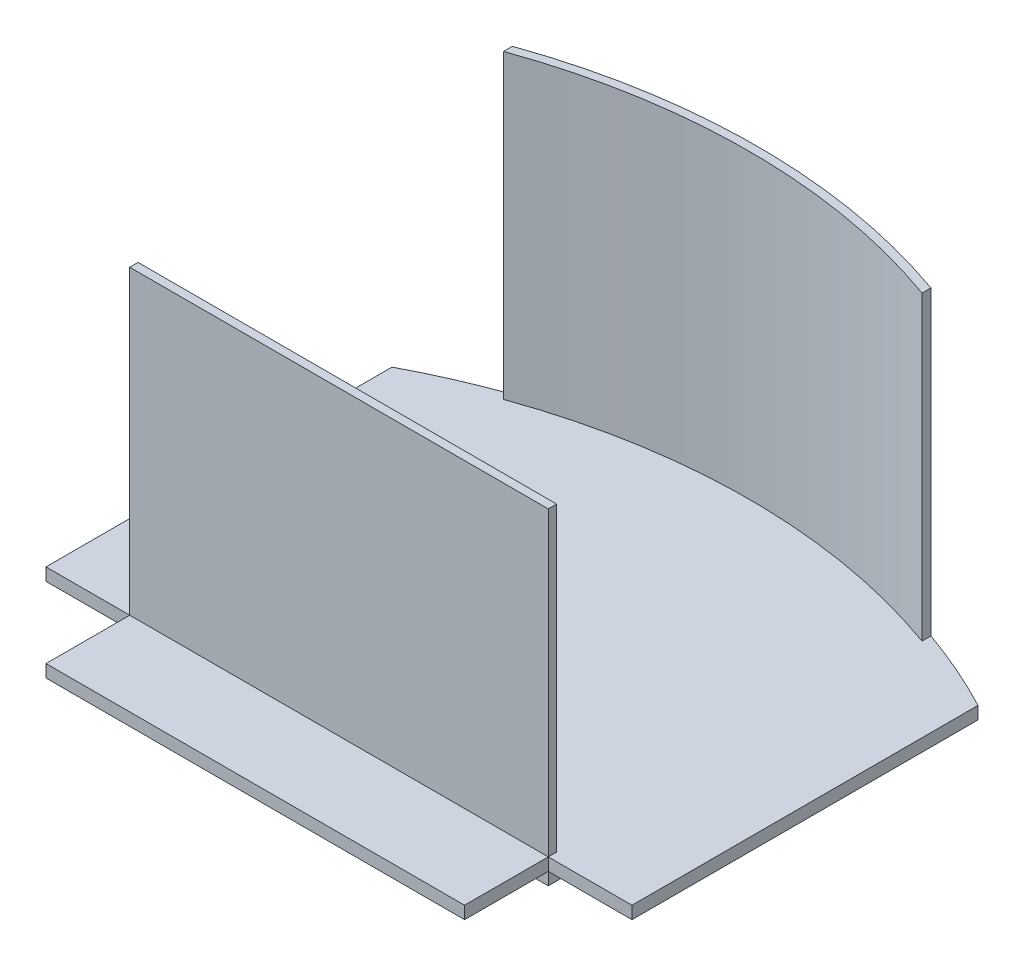
ISO-10303-21;
HEADER;
FILE_DESCRIPTION(('STEP AP214'),'2;1');
FILE_NAME('part.step','',(''),(''),'','','');
FILE_SCHEMA(('AUTOMOTIVE_DESIGN { 1 0 10303 214 1 1 1 1 }'));
ENDSEC;
DATA;
#1=APPLICATION_CONTEXT('core data for automotive mechanical design processes');
#2=APPLICATION_PROTOCOL_DEFINITION('international standard','automotive_design',2000,#1);
#3=PRODUCT_CONTEXT('',#1,'mechanical');
#4=PRODUCT('Part','Part','',(#3));
#5=PRODUCT_RELATED_PRODUCT_CATEGORY('part','',(#4));
#6=PRODUCT_DEFINITION_FORMATION('','',#4);
#7=PRODUCT_DEFINITION_CONTEXT('part definition',#1,'design');
#8=PRODUCT_DEFINITION('design','',#6,#7);
#9=PRODUCT_DEFINITION_SHAPE('','',#8);
#10=(LENGTH_UNIT() NAMED_UNIT(*) SI_UNIT(.MILLI.,.METRE.));
#11=(NAMED_UNIT(*) PLANE_ANGLE_UNIT() SI_UNIT($,.RADIAN.));
#12=(NAMED_UNIT(*) SI_UNIT($,.STERADIAN.) SOLID_ANGLE_UNIT());
#13=UNCERTAINTY_MEASURE_WITH_UNIT(LENGTH_MEASURE(1.E-05),#10,'distance_accuracy_value','');
#14=(GEOMETRIC_REPRESENTATION_CONTEXT(3) GLOBAL_UNCERTAINTY_ASSIGNED_CONTEXT((#13)) GLOBAL_UNIT_ASSIGNED_CONTEXT((#10,
#11,#12)) REPRESENTATION_CONTEXT('',''));
#15=CARTESIAN_POINT('',(0.,0.,0.));
#16=DIRECTION('',(0.,0.,1.));
#17=DIRECTION('',(1.,0.,0.));
#18=AXIS2_PLACEMENT_3D('',#15,#16,#17);
#19=CARTESIAN_POINT('',(-143.563874270696,6.,-52.));
#20=DIRECTION('',(0.,0.,-1.));
#21=DIRECTION('',(-1.,0.,0.));
#22=AXIS2_PLACEMENT_3D('',#19,#20,#21);
#23=PLANE('',#22);
#24=DIRECTION('',(0.,-1.,0.));
#25=VECTOR('',#24,1.);
#26=CARTESIAN_POINT('',(50.,78.,-52.));
#27=LINE('',#26,#25);
#28=CARTESIAN_POINT('',(50.,78.,-52.));
#29=VERTEX_POINT('',#28);
#30=CARTESIAN_POINT('',(50.,6.,-52.));
#31=VERTEX_POINT('',#30);
#32=EDGE_CURVE('E177',#29,#31,#27,.T.);
#33=ORIENTED_EDGE('',*,*,#32,.T.);
#34=DIRECTION('',(1.,0.,0.));
#35=VECTOR('',#34,1.);
#36=CARTESIAN_POINT('',(-50.,6.00000000000001,-52.));
#37=LINE('',#36,#35);
#38=CARTESIAN_POINT('',(-50.,6.00000000000001,-52.));
#39=VERTEX_POINT('',#38);
#40=EDGE_CURVE('E164',#39,#31,#37,.T.);
#41=ORIENTED_EDGE('',*,*,#40,.F.);
#42=DIRECTION('',(0.,1.,0.));
#43=VECTOR('',#42,1.);
#44=CARTESIAN_POINT('',(-50.,6.00000000000001,-52.));
#45=LINE('',#44,#43);
#46=CARTESIAN_POINT('',(-50.,78.,-52.));
#47=VERTEX_POINT('',#46);
#48=EDGE_CURVE('E341',#39,#47,#45,.T.);
#49=ORIENTED_EDGE('',*,*,#48,.T.);
#50=DIRECTION('',(1.,0.,0.));
#51=VECTOR('',#50,1.);
#52=CARTESIAN_POINT('',(-50.,78.,-52.));
#53=LINE('',#52,#51);
#54=EDGE_CURVE('E179',#47,#29,#53,.T.);
#55=ORIENTED_EDGE('',*,*,#54,.T.);
#56=EDGE_LOOP('',(#33,#41,#49,#55));
#57=FACE_BOUND('',#56,.T.);
#58=ADVANCED_FACE('F35',(#57),#23,.T.);
#59=CARTESIAN_POINT('',(0.,6.,0.));
#60=DIRECTION('',(0.,-1.,0.));
#61=DIRECTION('',(0.,0.,-1.));
#62=AXIS2_PLACEMENT_3D('',#59,#60,#61);
#63=CYLINDRICAL_SURFACE('',#62,148.);
#64=CARTESIAN_POINT('',(0.,6.00000000000001,1.63757896132211E-12));
#65=DIRECTION('',(0.,1.,0.));
#66=DIRECTION('',(0.,0.,1.));
#67=AXIS2_PLACEMENT_3D('',#64,#65,#66);
#68=CIRCLE('',#67,148.000000000002);
#69=CARTESIAN_POINT('',(50.,6.00000000000001,-139.298241194927));
#70=VERTEX_POINT('',#69);
#71=CARTESIAN_POINT('',(-50.0000000000001,6.00000000000001,-139.298241194927));
#72=VERTEX_POINT('',#71);
#73=EDGE_CURVE('E173',#70,#72,#68,.T.);
#74=ORIENTED_EDGE('',*,*,#73,.F.);
#75=DIRECTION('',(0.,-1.,0.));
#76=VECTOR('',#75,1.);
#77=CARTESIAN_POINT('',(50.,76.,-139.298241194927));
#78=LINE('',#77,#76);
#79=CARTESIAN_POINT('',(50.,78.,-139.298241194927));
#80=VERTEX_POINT('',#79);
#81=EDGE_CURVE('E183',#80,#70,#78,.T.);
#82=ORIENTED_EDGE('',*,*,#81,.F.);
#83=CARTESIAN_POINT('',(0.,78.,1.63757896132211E-12));
#84=DIRECTION('',(0.,1.,0.));
#85=DIRECTION('',(0.,0.,1.));
#86=AXIS2_PLACEMENT_3D('',#83,#84,#85);
#87=CIRCLE('',#86,148.000000000002);
#88=CARTESIAN_POINT('',(-50.0000000000001,78.,-139.298241194927));
#89=VERTEX_POINT('',#88);
#90=EDGE_CURVE('E174',#80,#89,#87,.T.);
#91=ORIENTED_EDGE('',*,*,#90,.T.);
#92=DIRECTION('',(0.,1.,0.));
#93=VECTOR('',#92,1.);
#94=CARTESIAN_POINT('',(-50.0000000000001,6.00000000000001,-139.298241194927));
#95=LINE('',#94,#93);
#96=EDGE_CURVE('E364',#72,#89,#95,.T.);
#97=ORIENTED_EDGE('',*,*,#96,.F.);
#98=EDGE_LOOP('',(#74,#82,#91,#97));
#99=FACE_BOUND('',#98,.T.);
#100=ADVANCED_FACE('F371',(#99),#63,.F.);
#101=CARTESIAN_POINT('',(50.,78.,-50.));
#102=DIRECTION('',(-1.,0.,0.));
#103=DIRECTION('',(0.,0.,1.));
#104=AXIS2_PLACEMENT_3D('',#101,#102,#103);
#105=PLANE('',#104);
#106=DIRECTION('',(0.,0.,-1.));
#107=VECTOR('',#106,1.);
#108=CARTESIAN_POINT('',(50.,78.,-50.));
#109=LINE('',#108,#107);
#110=CARTESIAN_POINT('',(50.,78.,-141.42135623731));
#111=VERTEX_POINT('',#110);
#112=EDGE_CURVE('E357',#80,#111,#109,.T.);
#113=ORIENTED_EDGE('',*,*,#112,.F.);
#114=ORIENTED_EDGE('',*,*,#81,.T.);
#115=DIRECTION('',(0.,0.,-1.));
#116=VECTOR('',#115,1.);
#117=CARTESIAN_POINT('',(50.,6.,-50.));
#118=LINE('',#117,#116);
#119=CARTESIAN_POINT('',(50.,6.,-141.42135623731));
#120=VERTEX_POINT('',#119);
#121=EDGE_CURVE('E61',#70,#120,#118,.T.);
#122=ORIENTED_EDGE('',*,*,#121,.T.);
#123=DIRECTION('',(0.,-1.,0.));
#124=VECTOR('',#123,1.);
#125=CARTESIAN_POINT('',(50.,78.,-141.42135623731));
#126=LINE('',#125,#124);
#127=EDGE_CURVE('E199',#111,#120,#126,.T.);
#128=ORIENTED_EDGE('',*,*,#127,.F.);
#129=EDGE_LOOP('',(#113,#114,#122,#128));
#130=FACE_BOUND('',#129,.T.);
#131=ADVANCED_FACE('F376',(#130),#105,.F.);
#132=CARTESIAN_POINT('',(-50.,78.,-50.));
#133=DIRECTION('',(1.,0.,0.));
#134=DIRECTION('',(0.,0.,-1.));
#135=AXIS2_PLACEMENT_3D('',#132,#133,#134);
#136=PLANE('',#135);
#137=DIRECTION('',(0.,0.,1.));
#138=VECTOR('',#137,1.);
#139=CARTESIAN_POINT('',(-50.,6.,-50.));
#140=LINE('',#139,#138);
#141=CARTESIAN_POINT('',(-50.,6.,-141.42135623731));
#142=VERTEX_POINT('',#141);
#143=EDGE_CURVE('E53',#142,#72,#140,.T.);
#144=ORIENTED_EDGE('',*,*,#143,.T.);
#145=ORIENTED_EDGE('',*,*,#96,.T.);
#146=DIRECTION('',(0.,0.,1.));
#147=VECTOR('',#146,1.);
#148=CARTESIAN_POINT('',(-50.,78.,-50.));
#149=LINE('',#148,#147);
#150=CARTESIAN_POINT('',(-50.0000000000001,78.,-141.42135623731));
#151=VERTEX_POINT('',#150);
#152=EDGE_CURVE('E191',#151,#89,#149,.T.);
#153=ORIENTED_EDGE('',*,*,#152,.F.);
#154=DIRECTION('',(0.,-1.,0.));
#155=VECTOR('',#154,1.);
#156=CARTESIAN_POINT('',(-50.0000000000001,78.,-141.42135623731));
#157=LINE('',#156,#155);
#158=EDGE_CURVE('E348',#151,#142,#157,.T.);
#159=ORIENTED_EDGE('',*,*,#158,.T.);
#160=EDGE_LOOP('',(#144,#145,#153,#159));
#161=FACE_BOUND('',#160,.T.);
#162=ADVANCED_FACE('F373',(#161),#136,.F.);
#163=CARTESIAN_POINT('',(0.,78.,1.38777878078145E-13));
#164=DIRECTION('',(0.,-1.,0.));
#165=DIRECTION('',(0.,0.,-1.));
#166=AXIS2_PLACEMENT_3D('',#163,#164,#165);
#167=PLANE('',#166);
#168=ORIENTED_EDGE('',*,*,#152,.T.);
#169=ORIENTED_EDGE('',*,*,#90,.F.);
#170=ORIENTED_EDGE('',*,*,#112,.T.);
#171=CARTESIAN_POINT('',(0.,78.,1.38777878078145E-13));
#172=DIRECTION('',(0.,1.,0.));
#173=DIRECTION('',(0.,0.,-1.));
#174=AXIS2_PLACEMENT_3D('',#171,#172,#173);
#175=CIRCLE('',#174,150.);
#176=EDGE_CURVE('E350',#111,#151,#175,.T.);
#177=ORIENTED_EDGE('',*,*,#176,.T.);
#178=EDGE_LOOP('',(#168,#169,#170,#177));
#179=FACE_BOUND('',#178,.T.);
#180=ADVANCED_FACE('F374',(#179),#167,.F.);
#181=ORIENTED_EDGE('',*,*,#32,.F.);
#182=CARTESIAN_POINT('',(50.,78.,-50.));
#183=VERTEX_POINT('',#182);
#184=EDGE_CURVE('E353',#183,#29,#109,.T.);
#185=ORIENTED_EDGE('',*,*,#184,.F.);
#186=DIRECTION('',(0.,-1.,0.));
#187=VECTOR('',#186,1.);
#188=CARTESIAN_POINT('',(50.,78.,-50.));
#189=LINE('',#188,#187);
#190=CARTESIAN_POINT('',(50.,6.,-50.));
#191=VERTEX_POINT('',#190);
#192=EDGE_CURVE('E188',#183,#191,#189,.T.);
#193=ORIENTED_EDGE('',*,*,#192,.T.);
#194=EDGE_CURVE('E168',#191,#31,#118,.T.);
#195=ORIENTED_EDGE('',*,*,#194,.T.);
#196=EDGE_LOOP('',(#181,#185,#193,#195));
#197=FACE_BOUND('',#196,.T.);
#198=ADVANCED_FACE('F186',(#197),#105,.F.);
#199=CARTESIAN_POINT('',(-143.563874270696,6.,-90.));
#200=DIRECTION('',(0.,1.,0.));
#201=DIRECTION('',(0.,0.,1.));
#202=AXIS2_PLACEMENT_3D('',#199,#200,#201);
#203=PLANE('',#202);
#204=ORIENTED_EDGE('',*,*,#194,.F.);
#205=DIRECTION('',(1.,0.,0.));
#206=VECTOR('',#205,1.);
#207=CARTESIAN_POINT('',(-143.563874270696,6.,-50.));
#208=LINE('',#207,#206);
#209=CARTESIAN_POINT('',(70.,6.,-50.));
#210=VERTEX_POINT('',#209);
#211=EDGE_CURVE('E258',#191,#210,#208,.T.);
#212=ORIENTED_EDGE('',*,*,#211,.T.);
#213=DIRECTION('',(0.,0.,-1.));
#214=VECTOR('',#213,1.);
#215=CARTESIAN_POINT('',(70.,6.,-90.));
#216=LINE('',#215,#214);
#217=CARTESIAN_POINT('',(70.,6.,-132.664991614216));
#218=VERTEX_POINT('',#217);
#219=EDGE_CURVE('E261',#210,#218,#216,.T.);
#220=ORIENTED_EDGE('',*,*,#219,.T.);
#221=CARTESIAN_POINT('',(0.,6.,0.));
#222=DIRECTION('',(0.,1.,0.));
#223=DIRECTION('',(0.,0.,1.));
#224=AXIS2_PLACEMENT_3D('',#221,#222,#223);
#225=CIRCLE('',#224,150.);
#226=EDGE_CURVE('E272',#218,#120,#225,.T.);
#227=ORIENTED_EDGE('',*,*,#226,.T.);
#228=ORIENTED_EDGE('',*,*,#121,.F.);
#229=ORIENTED_EDGE('',*,*,#73,.T.);
#230=ORIENTED_EDGE('',*,*,#143,.F.);
#231=CARTESIAN_POINT('',(-70.,6.,-132.664991614216));
#232=VERTEX_POINT('',#231);
#233=EDGE_CURVE('E263',#142,#232,#225,.T.);
#234=ORIENTED_EDGE('',*,*,#233,.T.);
#235=DIRECTION('',(0.,0.,-1.));
#236=VECTOR('',#235,1.);
#237=CARTESIAN_POINT('',(-70.,6.,-90.));
#238=LINE('',#237,#236);
#239=CARTESIAN_POINT('',(-70.,6.,-50.));
#240=VERTEX_POINT('',#239);
#241=EDGE_CURVE('E266',#240,#232,#238,.T.);
#242=ORIENTED_EDGE('',*,*,#241,.F.);
#243=DIRECTION('',(1.,0.,0.));
#244=VECTOR('',#243,1.);
#245=CARTESIAN_POINT('',(-143.563874270696,6.,-50.));
#246=LINE('',#245,#244);
#247=CARTESIAN_POINT('',(-50.,6.,-50.));
#248=VERTEX_POINT('',#247);
#249=EDGE_CURVE('E305',#240,#248,#246,.T.);
#250=ORIENTED_EDGE('',*,*,#249,.T.);
#251=EDGE_CURVE('E39',#39,#248,#140,.T.);
#252=ORIENTED_EDGE('',*,*,#251,.F.);
#253=ORIENTED_EDGE('',*,*,#40,.T.);
#254=EDGE_LOOP('',(#204,#212,#220,#227,#228,#229,#230,#234,#242,#250,#252,#253));
#255=FACE_BOUND('',#254,.T.);
#256=ADVANCED_FACE('F166',(#255),#203,.T.);
#257=CARTESIAN_POINT('',(-143.563874270696,6.,-50.));
#258=DIRECTION('',(0.,0.,-1.));
#259=DIRECTION('',(-1.,0.,0.));
#260=AXIS2_PLACEMENT_3D('',#257,#258,#259);
#261=PLANE('',#260);
#262=DIRECTION('',(-1.,0.,0.));
#263=VECTOR('',#262,1.);
#264=CARTESIAN_POINT('',(0.,3.,-50.));
#265=LINE('',#264,#263);
#266=CARTESIAN_POINT('',(70.,3.,-50.));
#267=VERTEX_POINT('',#266);
#268=CARTESIAN_POINT('',(50.,3.,-50.));
#269=VERTEX_POINT('',#268);
#270=EDGE_CURVE('E211',#267,#269,#265,.T.);
#271=ORIENTED_EDGE('',*,*,#270,.F.);
#272=DIRECTION('',(0.,-1.,0.));
#273=VECTOR('',#272,1.);
#274=CARTESIAN_POINT('',(70.,6.,-50.));
#275=LINE('',#274,#273);
#276=EDGE_CURVE('E45',#210,#267,#275,.T.);
#277=ORIENTED_EDGE('',*,*,#276,.F.);
#278=ORIENTED_EDGE('',*,*,#211,.F.);
#279=DIRECTION('',(0.,-1.,0.));
#280=VECTOR('',#279,1.);
#281=CARTESIAN_POINT('',(50.,6.,-50.));
#282=LINE('',#281,#280);
#283=EDGE_CURVE('E11',#191,#269,#282,.T.);
#284=ORIENTED_EDGE('',*,*,#283,.T.);
#285=EDGE_LOOP('',(#271,#277,#278,#284));
#286=FACE_BOUND('',#285,.T.);
#287=ADVANCED_FACE('F389',(#286),#261,.F.);
#288=CARTESIAN_POINT('',(70.,6.,-90.));
#289=DIRECTION('',(-1.,0.,0.));
#290=DIRECTION('',(0.,0.,1.));
#291=AXIS2_PLACEMENT_3D('',#288,#289,#290);
#292=PLANE('',#291);
#293=DIRECTION('',(0.,0.,1.));
#294=VECTOR('',#293,1.);
#295=CARTESIAN_POINT('',(70.,3.,-233.563874270696));
#296=LINE('',#295,#294);
#297=CARTESIAN_POINT('',(70.,3.,-132.664991614216));
#298=VERTEX_POINT('',#297);
#299=EDGE_CURVE('E214',#298,#267,#296,.T.);
#300=ORIENTED_EDGE('',*,*,#299,.F.);
#301=DIRECTION('',(0.,-1.,0.));
#302=VECTOR('',#301,1.);
#303=CARTESIAN_POINT('',(70.,6.,-132.664991614216));
#304=LINE('',#303,#302);
#305=EDGE_CURVE('E276',#218,#298,#304,.T.);
#306=ORIENTED_EDGE('',*,*,#305,.F.);
#307=ORIENTED_EDGE('',*,*,#219,.F.);
#308=ORIENTED_EDGE('',*,*,#276,.T.);
#309=EDGE_LOOP('',(#300,#306,#307,#308));
#310=FACE_BOUND('',#309,.T.);
#311=ADVANCED_FACE('F383',(#310),#292,.F.);
#312=CARTESIAN_POINT('',(50.,6.,-90.));
#313=DIRECTION('',(-1.,0.,0.));
#314=DIRECTION('',(0.,0.,1.));
#315=AXIS2_PLACEMENT_3D('',#312,#313,#314);
#316=PLANE('',#315);
#317=DIRECTION('',(0.,0.,1.));
#318=VECTOR('',#317,1.);
#319=CARTESIAN_POINT('',(50.,3.,-233.563874270696));
#320=LINE('',#319,#318);
#321=CARTESIAN_POINT('',(50.,3.,-30.));
#322=VERTEX_POINT('',#321);
#323=EDGE_CURVE('E234',#269,#322,#320,.T.);
#324=ORIENTED_EDGE('',*,*,#323,.F.);
#325=ORIENTED_EDGE('',*,*,#283,.F.);
#326=DIRECTION('',(0.,0.,-1.));
#327=VECTOR('',#326,1.);
#328=CARTESIAN_POINT('',(50.,6.,-90.));
#329=LINE('',#328,#327);
#330=CARTESIAN_POINT('',(50.,6.,-30.));
#331=VERTEX_POINT('',#330);
#332=EDGE_CURVE('E255',#331,#191,#329,.T.);
#333=ORIENTED_EDGE('',*,*,#332,.F.);
#334=DIRECTION('',(0.,-1.,0.));
#335=VECTOR('',#334,1.);
#336=CARTESIAN_POINT('',(50.,6.,-30.));
#337=LINE('',#336,#335);
#338=EDGE_CURVE('E291',#331,#322,#337,.T.);
#339=ORIENTED_EDGE('',*,*,#338,.T.);
#340=EDGE_LOOP('',(#324,#325,#333,#339));
#341=FACE_BOUND('',#340,.T.);
#342=ADVANCED_FACE('F37',(#341),#316,.F.);
#343=CARTESIAN_POINT('',(-50.,6.,-90.));
#344=DIRECTION('',(-1.,0.,0.));
#345=DIRECTION('',(0.,0.,1.));
#346=AXIS2_PLACEMENT_3D('',#343,#344,#345);
#347=PLANE('',#346);
#348=DIRECTION('',(0.,-1.,0.));
#349=VECTOR('',#348,1.);
#350=CARTESIAN_POINT('',(-50.,6.,-50.));
#351=LINE('',#350,#349);
#352=CARTESIAN_POINT('',(-50.,3.,-50.));
#353=VERTEX_POINT('',#352);
#354=EDGE_CURVE('E285',#248,#353,#351,.T.);
#355=ORIENTED_EDGE('',*,*,#354,.T.);
#356=DIRECTION('',(0.,0.,-1.));
#357=VECTOR('',#356,1.);
#358=CARTESIAN_POINT('',(-50.,3.,-233.563874270696));
#359=LINE('',#358,#357);
#360=CARTESIAN_POINT('',(-50.,3.,-30.));
#361=VERTEX_POINT('',#360);
#362=EDGE_CURVE('E221',#361,#353,#359,.T.);
#363=ORIENTED_EDGE('',*,*,#362,.F.);
#364=DIRECTION('',(0.,-1.,0.));
#365=VECTOR('',#364,1.);
#366=CARTESIAN_POINT('',(-50.,6.,-30.));
#367=LINE('',#366,#365);
#368=CARTESIAN_POINT('',(-50.,6.,-30.));
#369=VERTEX_POINT('',#368);
#370=EDGE_CURVE('E288',#369,#361,#367,.T.);
#371=ORIENTED_EDGE('',*,*,#370,.F.);
#372=DIRECTION('',(0.,0.,-1.));
#373=VECTOR('',#372,1.);
#374=CARTESIAN_POINT('',(-50.,6.,-90.));
#375=LINE('',#374,#373);
#376=EDGE_CURVE('E303',#369,#248,#375,.T.);
#377=ORIENTED_EDGE('',*,*,#376,.T.);
#378=EDGE_LOOP('',(#355,#363,#371,#377));
#379=FACE_BOUND('',#378,.T.);
#380=ADVANCED_FACE('F329',(#379),#347,.T.);
#381=CARTESIAN_POINT('',(-143.563874270696,6.,-30.));
#382=DIRECTION('',(0.,0.,1.));
#383=DIRECTION('',(1.,0.,0.));
#384=AXIS2_PLACEMENT_3D('',#381,#382,#383);
#385=PLANE('',#384);
#386=ORIENTED_EDGE('',*,*,#370,.T.);
#387=DIRECTION('',(-1.,0.,0.));
#388=VECTOR('',#387,1.);
#389=CARTESIAN_POINT('',(0.,3.,-30.));
#390=LINE('',#389,#388);
#391=EDGE_CURVE('E232',#322,#361,#390,.T.);
#392=ORIENTED_EDGE('',*,*,#391,.F.);
#393=ORIENTED_EDGE('',*,*,#338,.F.);
#394=DIRECTION('',(-1.,0.,0.));
#395=VECTOR('',#394,1.);
#396=CARTESIAN_POINT('',(-143.563874270696,6.,-30.));
#397=LINE('',#396,#395);
#398=EDGE_CURVE('E294',#331,#369,#397,.T.);
#399=ORIENTED_EDGE('',*,*,#398,.T.);
#400=EDGE_LOOP('',(#386,#392,#393,#399));
#401=FACE_BOUND('',#400,.T.);
#402=ADVANCED_FACE('F396',(#401),#385,.T.);
#403=CARTESIAN_POINT('',(-70.,6.,-90.));
#404=DIRECTION('',(-1.,0.,0.));
#405=DIRECTION('',(0.,0.,1.));
#406=AXIS2_PLACEMENT_3D('',#403,#404,#405);
#407=PLANE('',#406);
#408=DIRECTION('',(0.,-1.,0.));
#409=VECTOR('',#408,1.);
#410=CARTESIAN_POINT('',(-70.,6.,-132.664991614216));
#411=LINE('',#410,#409);
#412=CARTESIAN_POINT('',(-70.,3.,-132.664991614216));
#413=VERTEX_POINT('',#412);
#414=EDGE_CURVE('E279',#232,#413,#411,.T.);
#415=ORIENTED_EDGE('',*,*,#414,.T.);
#416=DIRECTION('',(0.,0.,-1.));
#417=VECTOR('',#416,1.);
#418=CARTESIAN_POINT('',(-70.,3.,-233.563874270696));
#419=LINE('',#418,#417);
#420=CARTESIAN_POINT('',(-70.,3.,-50.));
#421=VERTEX_POINT('',#420);
#422=EDGE_CURVE('E249',#421,#413,#419,.T.);
#423=ORIENTED_EDGE('',*,*,#422,.F.);
#424=DIRECTION('',(0.,-1.,0.));
#425=VECTOR('',#424,1.);
#426=CARTESIAN_POINT('',(-70.,6.,-50.));
#427=LINE('',#426,#425);
#428=EDGE_CURVE('E282',#240,#421,#427,.T.);
#429=ORIENTED_EDGE('',*,*,#428,.F.);
#430=ORIENTED_EDGE('',*,*,#241,.T.);
#431=EDGE_LOOP('',(#415,#423,#429,#430));
#432=FACE_BOUND('',#431,.T.);
#433=ADVANCED_FACE('F311',(#432),#407,.T.);
#434=CARTESIAN_POINT('',(-143.563874270696,6.,-50.));
#435=DIRECTION('',(0.,0.,-1.));
#436=DIRECTION('',(-1.,0.,0.));
#437=AXIS2_PLACEMENT_3D('',#434,#435,#436);
#438=PLANE('',#437);
#439=DIRECTION('',(-1.,0.,0.));
#440=VECTOR('',#439,1.);
#441=CARTESIAN_POINT('',(0.,3.,-50.));
#442=LINE('',#441,#440);
#443=EDGE_CURVE('E247',#353,#421,#442,.T.);
#444=ORIENTED_EDGE('',*,*,#443,.F.);
#445=ORIENTED_EDGE('',*,*,#354,.F.);
#446=ORIENTED_EDGE('',*,*,#249,.F.);
#447=ORIENTED_EDGE('',*,*,#428,.T.);
#448=EDGE_LOOP('',(#444,#445,#446,#447));
#449=FACE_BOUND('',#448,.T.);
#450=ADVANCED_FACE('F325',(#449),#438,.F.);
#451=DIRECTION('',(1.,0.,0.));
#452=VECTOR('',#451,1.);
#453=CARTESIAN_POINT('',(-143.563874270696,0.,-50.));
#454=LINE('',#453,#452);
#455=CARTESIAN_POINT('',(-50.,0.,-50.));
#456=VERTEX_POINT('',#455);
#457=CARTESIAN_POINT('',(50.,0.,-50.));
#458=VERTEX_POINT('',#457);
#459=EDGE_CURVE('E254',#456,#458,#454,.T.);
#460=ORIENTED_EDGE('',*,*,#459,.T.);
#461=DIRECTION('',(0.,-1.,0.));
#462=VECTOR('',#461,1.);
#463=CARTESIAN_POINT('',(50.,3.,-50.));
#464=LINE('',#463,#462);
#465=EDGE_CURVE('E212',#269,#458,#464,.T.);
#466=ORIENTED_EDGE('',*,*,#465,.F.);
#467=DIRECTION('',(1.,0.,0.));
#468=VECTOR('',#467,1.);
#469=CARTESIAN_POINT('',(0.,3.,-50.));
#470=LINE('',#469,#468);
#471=EDGE_CURVE('E236',#353,#269,#470,.T.);
#472=ORIENTED_EDGE('',*,*,#471,.F.);
#473=DIRECTION('',(0.,-1.,0.));
#474=VECTOR('',#473,1.);
#475=CARTESIAN_POINT('',(-50.,3.,-50.));
#476=LINE('',#475,#474);
#477=EDGE_CURVE('E229',#353,#456,#476,.T.);
#478=ORIENTED_EDGE('',*,*,#477,.T.);
#479=EDGE_LOOP('',(#460,#466,#472,#478));
#480=FACE_BOUND('',#479,.T.);
#481=ADVANCED_FACE('F444',(#480),#261,.F.);
#482=CARTESIAN_POINT('',(0.,6.,0.));
#483=DIRECTION('',(0.,-1.,0.));
#484=DIRECTION('',(0.,0.,-1.));
#485=AXIS2_PLACEMENT_3D('',#482,#483,#484);
#486=CYLINDRICAL_SURFACE('',#485,150.);
#487=CARTESIAN_POINT('',(0.,3.,0.));
#488=DIRECTION('',(0.,-1.,0.));
#489=DIRECTION('',(0.,0.,-1.));
#490=AXIS2_PLACEMENT_3D('',#487,#488,#489);
#491=CIRCLE('',#490,150.);
#492=CARTESIAN_POINT('',(50.,3.,-141.42135623731));
#493=VERTEX_POINT('',#492);
#494=EDGE_CURVE('E223',#493,#298,#491,.T.);
#495=ORIENTED_EDGE('',*,*,#494,.F.);
#496=DIRECTION('',(0.,-1.,0.));
#497=VECTOR('',#496,1.);
#498=CARTESIAN_POINT('',(50.,3.,-141.42135623731));
#499=LINE('',#498,#497);
#500=CARTESIAN_POINT('',(50.,0.,-141.42135623731));
#501=VERTEX_POINT('',#500);
#502=EDGE_CURVE('E215',#493,#501,#499,.T.);
#503=ORIENTED_EDGE('',*,*,#502,.T.);
#504=CARTESIAN_POINT('',(0.,0.,0.));
#505=DIRECTION('',(0.,1.,0.));
#506=DIRECTION('',(0.,0.,1.));
#507=AXIS2_PLACEMENT_3D('',#504,#505,#506);
#508=CIRCLE('',#507,150.);
#509=CARTESIAN_POINT('',(-50.,0.,-141.42135623731));
#510=VERTEX_POINT('',#509);
#511=EDGE_CURVE('E297',#501,#510,#508,.T.);
#512=ORIENTED_EDGE('',*,*,#511,.T.);
#513=DIRECTION('',(0.,-1.,0.));
#514=VECTOR('',#513,1.);
#515=CARTESIAN_POINT('',(-50.,3.,-141.42135623731));
#516=LINE('',#515,#514);
#517=CARTESIAN_POINT('',(-50.,3.,-141.42135623731));
#518=VERTEX_POINT('',#517);
#519=EDGE_CURVE('E251',#518,#510,#516,.T.);
#520=ORIENTED_EDGE('',*,*,#519,.F.);
#521=CARTESIAN_POINT('',(0.,3.,0.));
#522=DIRECTION('',(0.,-1.,0.));
#523=DIRECTION('',(0.,0.,-1.));
#524=AXIS2_PLACEMENT_3D('',#521,#522,#523);
#525=CIRCLE('',#524,150.);
#526=EDGE_CURVE('E239',#413,#518,#525,.T.);
#527=ORIENTED_EDGE('',*,*,#526,.F.);
#528=ORIENTED_EDGE('',*,*,#414,.F.);
#529=ORIENTED_EDGE('',*,*,#233,.F.);
#530=ORIENTED_EDGE('',*,*,#158,.F.);
#531=ORIENTED_EDGE('',*,*,#176,.F.);
#532=ORIENTED_EDGE('',*,*,#127,.T.);
#533=ORIENTED_EDGE('',*,*,#226,.F.);
#534=ORIENTED_EDGE('',*,*,#305,.T.);
#535=EDGE_LOOP('',(#495,#503,#512,#520,#527,#528,#529,#530,#531,#532,#533,#534));
#536=FACE_BOUND('',#535,.T.);
#537=ADVANCED_FACE('F319',(#536),#486,.T.);
#538=ORIENTED_EDGE('',*,*,#477,.F.);
#539=DIRECTION('',(0.,0.,1.));
#540=VECTOR('',#539,1.);
#541=CARTESIAN_POINT('',(-50.,3.,-233.563874270696));
#542=LINE('',#541,#540);
#543=EDGE_CURVE('E244',#518,#353,#542,.T.);
#544=ORIENTED_EDGE('',*,*,#543,.F.);
#545=ORIENTED_EDGE('',*,*,#519,.T.);
#546=DIRECTION('',(0.,0.,-1.));
#547=VECTOR('',#546,1.);
#548=CARTESIAN_POINT('',(-50.,0.,-90.));
#549=LINE('',#548,#547);
#550=EDGE_CURVE('E259',#456,#510,#549,.T.);
#551=ORIENTED_EDGE('',*,*,#550,.F.);
#552=EDGE_LOOP('',(#538,#544,#545,#551));
#553=FACE_BOUND('',#552,.T.);
#554=ADVANCED_FACE('F405',(#553),#347,.T.);
#555=DIRECTION('',(1.,0.,0.));
#556=VECTOR('',#555,1.);
#557=CARTESIAN_POINT('',(-50.,6.,-50.));
#558=LINE('',#557,#556);
#559=EDGE_CURVE('E193',#248,#191,#558,.T.);
#560=ORIENTED_EDGE('',*,*,#559,.F.);
#561=ORIENTED_EDGE('',*,*,#376,.F.);
#562=ORIENTED_EDGE('',*,*,#398,.F.);
#563=ORIENTED_EDGE('',*,*,#332,.T.);
#564=EDGE_LOOP('',(#560,#561,#562,#563));
#565=FACE_BOUND('',#564,.T.);
#566=ADVANCED_FACE('F342',(#565),#203,.T.);
#567=CARTESIAN_POINT('',(-143.563874270696,0.,-90.));
#568=DIRECTION('',(0.,1.,0.));
#569=DIRECTION('',(0.,0.,1.));
#570=AXIS2_PLACEMENT_3D('',#567,#568,#569);
#571=PLANE('',#570);
#572=ORIENTED_EDGE('',*,*,#511,.F.);
#573=DIRECTION('',(0.,0.,-1.));
#574=VECTOR('',#573,1.);
#575=CARTESIAN_POINT('',(50.,0.,-233.563874270696));
#576=LINE('',#575,#574);
#577=EDGE_CURVE('E218',#458,#501,#576,.T.);
#578=ORIENTED_EDGE('',*,*,#577,.F.);
#579=ORIENTED_EDGE('',*,*,#459,.F.);
#580=ORIENTED_EDGE('',*,*,#550,.T.);
#581=EDGE_LOOP('',(#572,#578,#579,#580));
#582=FACE_BOUND('',#581,.T.);
#583=ADVANCED_FACE('F434',(#582),#571,.F.);
#584=CARTESIAN_POINT('',(0.,3.,-233.563874270696));
#585=DIRECTION('',(0.,-1.,0.));
#586=DIRECTION('',(0.,0.,-1.));
#587=AXIS2_PLACEMENT_3D('',#584,#585,#586);
#588=PLANE('',#587);
#589=ORIENTED_EDGE('',*,*,#526,.T.);
#590=ORIENTED_EDGE('',*,*,#543,.T.);
#591=ORIENTED_EDGE('',*,*,#443,.T.);
#592=ORIENTED_EDGE('',*,*,#422,.T.);
#593=EDGE_LOOP('',(#589,#590,#591,#592));
#594=FACE_BOUND('',#593,.T.);
#595=ADVANCED_FACE('F322',(#594),#588,.T.);
#596=CARTESIAN_POINT('',(0.,3.,-233.563874270696));
#597=DIRECTION('',(0.,-1.,0.));
#598=DIRECTION('',(0.,0.,-1.));
#599=AXIS2_PLACEMENT_3D('',#596,#597,#598);
#600=PLANE('',#599);
#601=ORIENTED_EDGE('',*,*,#362,.T.);
#602=ORIENTED_EDGE('',*,*,#471,.T.);
#603=ORIENTED_EDGE('',*,*,#323,.T.);
#604=ORIENTED_EDGE('',*,*,#391,.T.);
#605=EDGE_LOOP('',(#601,#602,#603,#604));
#606=FACE_BOUND('',#605,.T.);
#607=ADVANCED_FACE('F394',(#606),#600,.T.);
#608=CARTESIAN_POINT('',(50.,3.,-233.563874270696));
#609=DIRECTION('',(-1.,0.,0.));
#610=DIRECTION('',(0.,0.,1.));
#611=AXIS2_PLACEMENT_3D('',#608,#609,#610);
#612=PLANE('',#611);
#613=ORIENTED_EDGE('',*,*,#577,.T.);
#614=ORIENTED_EDGE('',*,*,#502,.F.);
#615=DIRECTION('',(0.,0.,-1.));
#616=VECTOR('',#615,1.);
#617=CARTESIAN_POINT('',(50.,3.,-233.563874270696));
#618=LINE('',#617,#616);
#619=EDGE_CURVE('E219',#269,#493,#618,.T.);
#620=ORIENTED_EDGE('',*,*,#619,.F.);
#621=ORIENTED_EDGE('',*,*,#465,.T.);
#622=EDGE_LOOP('',(#613,#614,#620,#621));
#623=FACE_BOUND('',#622,.T.);
#624=ADVANCED_FACE('F424',(#623),#612,.F.);
#625=CARTESIAN_POINT('',(0.,3.,-233.563874270696));
#626=DIRECTION('',(0.,-1.,0.));
#627=DIRECTION('',(0.,0.,-1.));
#628=AXIS2_PLACEMENT_3D('',#625,#626,#627);
#629=PLANE('',#628);
#630=ORIENTED_EDGE('',*,*,#270,.T.);
#631=ORIENTED_EDGE('',*,*,#619,.T.);
#632=ORIENTED_EDGE('',*,*,#494,.T.);
#633=ORIENTED_EDGE('',*,*,#299,.T.);
#634=EDGE_LOOP('',(#630,#631,#632,#633));
#635=FACE_BOUND('',#634,.T.);
#636=ADVANCED_FACE('F386',(#635),#629,.T.);
#637=CARTESIAN_POINT('',(-50.,78.,-50.));
#638=VERTEX_POINT('',#637);
#639=EDGE_CURVE('E189',#47,#638,#149,.T.);
#640=ORIENTED_EDGE('',*,*,#639,.F.);
#641=ORIENTED_EDGE('',*,*,#48,.F.);
#642=ORIENTED_EDGE('',*,*,#251,.T.);
#643=DIRECTION('',(0.,-1.,0.));
#644=VECTOR('',#643,1.);
#645=CARTESIAN_POINT('',(-50.,78.,-50.));
#646=LINE('',#645,#644);
#647=EDGE_CURVE('E208',#638,#248,#646,.T.);
#648=ORIENTED_EDGE('',*,*,#647,.F.);
#649=EDGE_LOOP('',(#640,#641,#642,#648));
#650=FACE_BOUND('',#649,.T.);
#651=ADVANCED_FACE('F340',(#650),#136,.F.);
#652=CARTESIAN_POINT('',(-50.,78.,-50.));
#653=DIRECTION('',(0.,0.,-1.));
#654=DIRECTION('',(-1.,0.,0.));
#655=AXIS2_PLACEMENT_3D('',#652,#653,#654);
#656=PLANE('',#655);
#657=ORIENTED_EDGE('',*,*,#559,.T.);
#658=ORIENTED_EDGE('',*,*,#192,.F.);
#659=DIRECTION('',(1.,0.,0.));
#660=VECTOR('',#659,1.);
#661=CARTESIAN_POINT('',(-50.,78.,-50.));
#662=LINE('',#661,#660);
#663=EDGE_CURVE('E337',#638,#183,#662,.T.);
#664=ORIENTED_EDGE('',*,*,#663,.F.);
#665=ORIENTED_EDGE('',*,*,#647,.T.);
#666=EDGE_LOOP('',(#657,#658,#664,#665));
#667=FACE_BOUND('',#666,.T.);
#668=ADVANCED_FACE('F336',(#667),#656,.F.);
#669=ORIENTED_EDGE('',*,*,#184,.T.);
#670=ORIENTED_EDGE('',*,*,#54,.F.);
#671=ORIENTED_EDGE('',*,*,#639,.T.);
#672=ORIENTED_EDGE('',*,*,#663,.T.);
#673=EDGE_LOOP('',(#669,#670,#671,#672));
#674=FACE_BOUND('',#673,.T.);
#675=ADVANCED_FACE('F414',(#674),#167,.F.);
#676=CLOSED_SHELL('',(#58,#100,#131,#162,#180,#198,#256,#287,#311,#342,#380,#402,#433,#450,#481,
#537,#554,#566,#583,#595,#607,#624,#636,#651,#668,#675));
#677=MANIFOLD_SOLID_BREP('B2',#676);
#678=ADVANCED_BREP_SHAPE_REPRESENTATION('',(#18,#677),#14);
#679=SHAPE_DEFINITION_REPRESENTATION(#9,#678);
ENDSEC;
END-ISO-10303-21;
